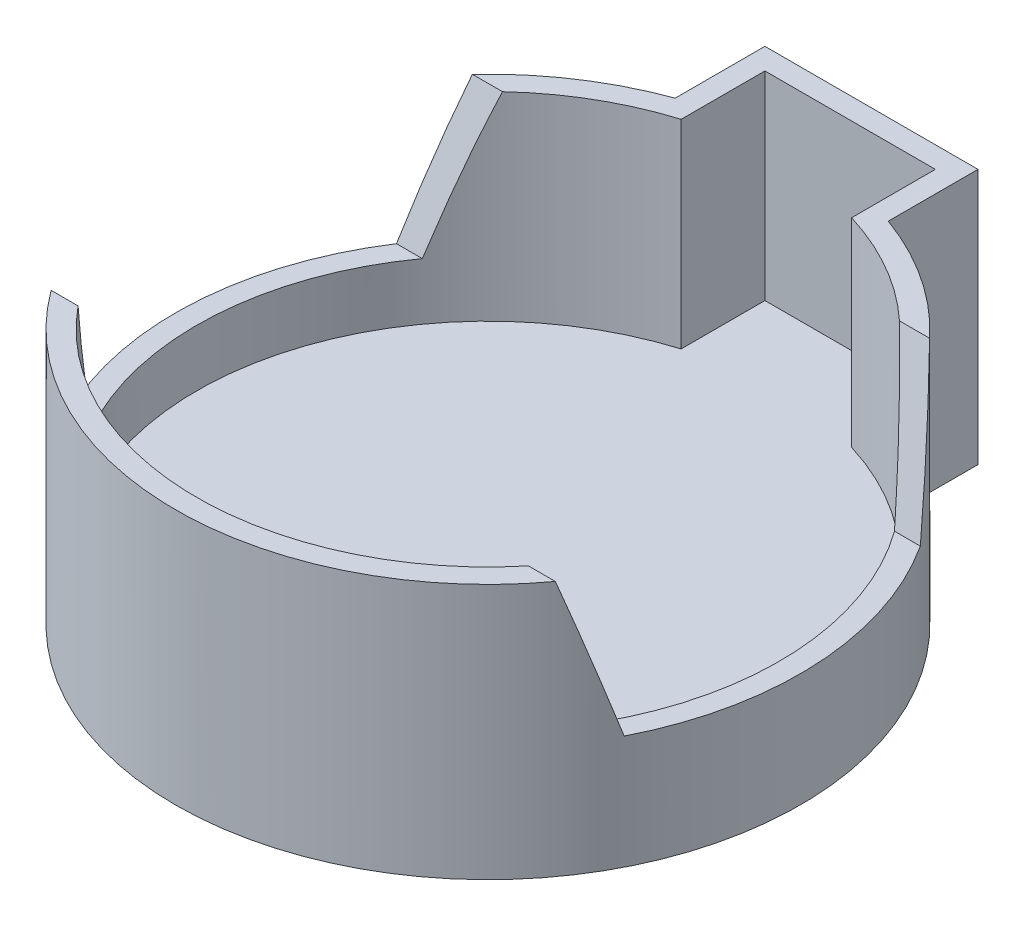
ISO-10303-21;
HEADER;
FILE_DESCRIPTION(('STEP AP214'),'2;1');
FILE_NAME('part.step','',(''),(''),'','','');
FILE_SCHEMA(('AUTOMOTIVE_DESIGN { 1 0 10303 214 1 1 1 1 }'));
ENDSEC;
DATA;
#1=APPLICATION_CONTEXT('core data for automotive mechanical design processes');
#2=APPLICATION_PROTOCOL_DEFINITION('international standard','automotive_design',2000,#1);
#3=PRODUCT_CONTEXT('',#1,'mechanical');
#4=PRODUCT('Part','Part','',(#3));
#5=PRODUCT_RELATED_PRODUCT_CATEGORY('part','',(#4));
#6=PRODUCT_DEFINITION_FORMATION('','',#4);
#7=PRODUCT_DEFINITION_CONTEXT('part definition',#1,'design');
#8=PRODUCT_DEFINITION('design','',#6,#7);
#9=PRODUCT_DEFINITION_SHAPE('','',#8);
#10=(LENGTH_UNIT() NAMED_UNIT(*) SI_UNIT(.MILLI.,.METRE.));
#11=(NAMED_UNIT(*) PLANE_ANGLE_UNIT() SI_UNIT($,.RADIAN.));
#12=(NAMED_UNIT(*) SI_UNIT($,.STERADIAN.) SOLID_ANGLE_UNIT());
#13=UNCERTAINTY_MEASURE_WITH_UNIT(LENGTH_MEASURE(1.E-05),#10,'distance_accuracy_value','');
#14=(GEOMETRIC_REPRESENTATION_CONTEXT(3) GLOBAL_UNCERTAINTY_ASSIGNED_CONTEXT((#13)) GLOBAL_UNIT_ASSIGNED_CONTEXT((#10,
#11,#12)) REPRESENTATION_CONTEXT('',''));
#15=CARTESIAN_POINT('',(0.,0.,0.));
#16=DIRECTION('',(0.,0.,1.));
#17=DIRECTION('',(1.,0.,0.));
#18=AXIS2_PLACEMENT_3D('',#15,#16,#17);
#19=CARTESIAN_POINT('',(0.,9.,0.));
#20=DIRECTION('',(0.,-1.,0.));
#21=DIRECTION('',(0.,0.,-1.));
#22=AXIS2_PLACEMENT_3D('',#19,#20,#21);
#23=PLANE('',#22);
#24=CARTESIAN_POINT('',(0.,9.,0.));
#25=DIRECTION('',(0.,1.,0.));
#26=DIRECTION('',(0.,0.,-1.));
#27=AXIS2_PLACEMENT_3D('',#24,#25,#26);
#28=CIRCLE('',#27,11.);
#29=CARTESIAN_POINT('',(-3.75,9.,-10.3410589399732));
#30=VERTEX_POINT('',#29);
#31=CARTESIAN_POINT('',(-8.04673846971554,9.,-7.5));
#32=VERTEX_POINT('',#31);
#33=EDGE_CURVE('E219',#30,#32,#28,.T.);
#34=ORIENTED_EDGE('',*,*,#33,.T.);
#35=DIRECTION('',(1.,0.,0.));
#36=VECTOR('',#35,1.);
#37=CARTESIAN_POINT('',(-11.,9.,-7.5));
#38=LINE('',#37,#36);
#39=CARTESIAN_POINT('',(-6.98659430624106,9.,-7.5));
#40=VERTEX_POINT('',#39);
#41=EDGE_CURVE('E173',#32,#40,#38,.T.);
#42=ORIENTED_EDGE('',*,*,#41,.T.);
#43=CARTESIAN_POINT('',(0.,9.,0.));
#44=DIRECTION('',(0.,-1.,0.));
#45=DIRECTION('',(0.,0.,-1.));
#46=AXIS2_PLACEMENT_3D('',#43,#44,#45);
#47=CIRCLE('',#46,10.25);
#48=CARTESIAN_POINT('',(-3.,9.,-9.80114789195633));
#49=VERTEX_POINT('',#48);
#50=EDGE_CURVE('E209',#49,#40,#47,.F.);
#51=ORIENTED_EDGE('',*,*,#50,.F.);
#52=DIRECTION('',(0.,0.,1.));
#53=VECTOR('',#52,1.);
#54=CARTESIAN_POINT('',(-3.,9.,0.));
#55=LINE('',#54,#53);
#56=CARTESIAN_POINT('',(-3.,9.,-12.75));
#57=VERTEX_POINT('',#56);
#58=EDGE_CURVE('E198',#57,#49,#55,.T.);
#59=ORIENTED_EDGE('',*,*,#58,.F.);
#60=DIRECTION('',(-1.,0.,0.));
#61=VECTOR('',#60,1.);
#62=CARTESIAN_POINT('',(0.,9.,-12.75));
#63=LINE('',#62,#61);
#64=CARTESIAN_POINT('',(3.,9.,-12.75));
#65=VERTEX_POINT('',#64);
#66=EDGE_CURVE('E215',#65,#57,#63,.T.);
#67=ORIENTED_EDGE('',*,*,#66,.F.);
#68=DIRECTION('',(0.,0.,-1.));
#69=VECTOR('',#68,1.);
#70=CARTESIAN_POINT('',(3.00000000000001,9.,0.));
#71=LINE('',#70,#69);
#72=CARTESIAN_POINT('',(3.,9.,-9.80114789195633));
#73=VERTEX_POINT('',#72);
#74=EDGE_CURVE('E212',#73,#65,#71,.T.);
#75=ORIENTED_EDGE('',*,*,#74,.F.);
#76=CARTESIAN_POINT('',(6.98659430624106,9.,-7.5));
#77=VERTEX_POINT('',#76);
#78=EDGE_CURVE('E208',#77,#73,#47,.F.);
#79=ORIENTED_EDGE('',*,*,#78,.F.);
#80=CARTESIAN_POINT('',(8.04673846971554,9.,-7.5));
#81=VERTEX_POINT('',#80);
#82=EDGE_CURVE('E176',#77,#81,#38,.T.);
#83=ORIENTED_EDGE('',*,*,#82,.T.);
#84=CARTESIAN_POINT('',(3.75,9.,-10.3410589399732));
#85=VERTEX_POINT('',#84);
#86=EDGE_CURVE('E223',#81,#85,#28,.T.);
#87=ORIENTED_EDGE('',*,*,#86,.T.);
#88=DIRECTION('',(0.,0.,-1.));
#89=VECTOR('',#88,1.);
#90=CARTESIAN_POINT('',(3.75,9.,-10.3410589399732));
#91=LINE('',#90,#89);
#92=CARTESIAN_POINT('',(3.75,9.,-13.5));
#93=VERTEX_POINT('',#92);
#94=EDGE_CURVE('E222',#85,#93,#91,.T.);
#95=ORIENTED_EDGE('',*,*,#94,.T.);
#96=DIRECTION('',(-1.,0.,0.));
#97=VECTOR('',#96,1.);
#98=CARTESIAN_POINT('',(-3.75,9.,-13.5));
#99=LINE('',#98,#97);
#100=CARTESIAN_POINT('',(-3.75,9.,-13.5));
#101=VERTEX_POINT('',#100);
#102=EDGE_CURVE('E225',#93,#101,#99,.T.);
#103=ORIENTED_EDGE('',*,*,#102,.T.);
#104=DIRECTION('',(0.,0.,1.));
#105=VECTOR('',#104,1.);
#106=CARTESIAN_POINT('',(-3.75,9.,-10.3410589399732));
#107=LINE('',#106,#105);
#108=EDGE_CURVE('E227',#101,#30,#107,.T.);
#109=ORIENTED_EDGE('',*,*,#108,.T.);
#110=EDGE_LOOP('',(#34,#42,#51,#59,#67,#75,#79,#83,#87,#95,#103,#109));
#111=FACE_BOUND('',#110,.T.);
#112=ADVANCED_FACE('F35',(#111),#23,.F.);
#113=CARTESIAN_POINT('',(-8.87411967464942,9.,6.5));
#114=VERTEX_POINT('',#113);
#115=CARTESIAN_POINT('',(8.87411967464942,9.,6.5));
#116=VERTEX_POINT('',#115);
#117=EDGE_CURVE('E172',#114,#116,#28,.T.);
#118=ORIENTED_EDGE('',*,*,#117,.T.);
#119=DIRECTION('',(1.,0.,0.));
#120=VECTOR('',#119,1.);
#121=CARTESIAN_POINT('',(-11.,9.,6.5));
#122=LINE('',#121,#120);
#123=CARTESIAN_POINT('',(7.92543374207367,9.,6.5));
#124=VERTEX_POINT('',#123);
#125=EDGE_CURVE('E179',#124,#116,#122,.T.);
#126=ORIENTED_EDGE('',*,*,#125,.F.);
#127=CARTESIAN_POINT('',(-7.92543374207368,9.,6.5));
#128=VERTEX_POINT('',#127);
#129=EDGE_CURVE('E213',#128,#124,#47,.F.);
#130=ORIENTED_EDGE('',*,*,#129,.F.);
#131=EDGE_CURVE('E59',#114,#128,#122,.T.);
#132=ORIENTED_EDGE('',*,*,#131,.F.);
#133=EDGE_LOOP('',(#118,#126,#130,#132));
#134=FACE_BOUND('',#133,.T.);
#135=ADVANCED_FACE('F261',(#134),#23,.F.);
#136=CARTESIAN_POINT('',(0.,9.,0.));
#137=DIRECTION('',(0.,-1.,0.));
#138=DIRECTION('',(0.,0.,-1.));
#139=AXIS2_PLACEMENT_3D('',#136,#137,#138);
#140=CYLINDRICAL_SURFACE('',#139,11.);
#141=ORIENTED_EDGE('',*,*,#86,.F.);
#142=CARTESIAN_POINT('',(0.,-16.,0.));
#143=DIRECTION('',(0.,-0.287347885566346,-0.957826285221151));
#144=DIRECTION('',(0.,-0.957826285221151,0.287347885566346));
#145=AXIS2_PLACEMENT_3D('',#142,#143,#144);
#146=ELLIPSE('',#145,38.2811238660053,11.);
#147=CARTESIAN_POINT('',(9.21954445729289,4.,-6.));
#148=VERTEX_POINT('',#147);
#149=EDGE_CURVE('E181',#81,#148,#146,.T.);
#150=ORIENTED_EDGE('',*,*,#149,.T.);
#151=CARTESIAN_POINT('',(0.,4.,0.));
#152=DIRECTION('',(0.,-1.,0.));
#153=DIRECTION('',(0.,0.,-1.));
#154=AXIS2_PLACEMENT_3D('',#151,#152,#153);
#155=CIRCLE('',#154,11.);
#156=CARTESIAN_POINT('',(9.79795897113271,4.,5.));
#157=VERTEX_POINT('',#156);
#158=EDGE_CURVE('E160',#148,#157,#155,.T.);
#159=ORIENTED_EDGE('',*,*,#158,.T.);
#160=CARTESIAN_POINT('',(0.,-12.6666666666667,0.));
#161=DIRECTION('',(0.,-0.287347885566346,0.957826285221151));
#162=DIRECTION('',(0.,-0.957826285221151,-0.287347885566346));
#163=AXIS2_PLACEMENT_3D('',#160,#161,#162);
#164=ELLIPSE('',#163,38.2811238660053,11.);
#165=EDGE_CURVE('E161',#157,#116,#164,.T.);
#166=ORIENTED_EDGE('',*,*,#165,.T.);
#167=ORIENTED_EDGE('',*,*,#117,.F.);
#168=CARTESIAN_POINT('',(-9.79795897113271,4.,5.));
#169=VERTEX_POINT('',#168);
#170=EDGE_CURVE('E164',#114,#169,#164,.T.);
#171=ORIENTED_EDGE('',*,*,#170,.T.);
#172=CARTESIAN_POINT('',(-9.21954445729289,4.,-6.));
#173=VERTEX_POINT('',#172);
#174=EDGE_CURVE('E149',#169,#173,#155,.T.);
#175=ORIENTED_EDGE('',*,*,#174,.T.);
#176=EDGE_CURVE('E184',#173,#32,#146,.T.);
#177=ORIENTED_EDGE('',*,*,#176,.T.);
#178=ORIENTED_EDGE('',*,*,#33,.F.);
#179=DIRECTION('',(0.,-1.,0.));
#180=VECTOR('',#179,1.);
#181=CARTESIAN_POINT('',(-3.75,9.,-10.3410589399732));
#182=LINE('',#181,#180);
#183=CARTESIAN_POINT('',(-3.75,0.,-10.3410589399732));
#184=VERTEX_POINT('',#183);
#185=EDGE_CURVE('E229',#30,#184,#182,.T.);
#186=ORIENTED_EDGE('',*,*,#185,.T.);
#187=CARTESIAN_POINT('',(0.,0.,0.));
#188=DIRECTION('',(0.,1.,0.));
#189=DIRECTION('',(0.,0.,-1.));
#190=AXIS2_PLACEMENT_3D('',#187,#188,#189);
#191=CIRCLE('',#190,11.);
#192=CARTESIAN_POINT('',(3.75,0.,-10.3410589399732));
#193=VERTEX_POINT('',#192);
#194=EDGE_CURVE('E192',#184,#193,#191,.T.);
#195=ORIENTED_EDGE('',*,*,#194,.T.);
#196=DIRECTION('',(0.,-1.,0.));
#197=VECTOR('',#196,1.);
#198=CARTESIAN_POINT('',(3.75,9.,-10.3410589399732));
#199=LINE('',#198,#197);
#200=EDGE_CURVE('E246',#85,#193,#199,.T.);
#201=ORIENTED_EDGE('',*,*,#200,.F.);
#202=EDGE_LOOP('',(#141,#150,#159,#166,#167,#171,#175,#177,#178,#186,#195,#201));
#203=FACE_BOUND('',#202,.T.);
#204=ADVANCED_FACE('F37',(#203),#140,.T.);
#205=CARTESIAN_POINT('',(3.75,9.,-10.3410589399732));
#206=DIRECTION('',(-1.,0.,0.));
#207=DIRECTION('',(0.,0.,1.));
#208=AXIS2_PLACEMENT_3D('',#205,#206,#207);
#209=PLANE('',#208);
#210=DIRECTION('',(0.,0.,-1.));
#211=VECTOR('',#210,1.);
#212=CARTESIAN_POINT('',(3.75,0.,-10.3410589399732));
#213=LINE('',#212,#211);
#214=CARTESIAN_POINT('',(3.75,0.,-13.5));
#215=VERTEX_POINT('',#214);
#216=EDGE_CURVE('E232',#193,#215,#213,.T.);
#217=ORIENTED_EDGE('',*,*,#216,.T.);
#218=DIRECTION('',(0.,-1.,0.));
#219=VECTOR('',#218,1.);
#220=CARTESIAN_POINT('',(3.75,9.,-13.5));
#221=LINE('',#220,#219);
#222=EDGE_CURVE('E243',#93,#215,#221,.T.);
#223=ORIENTED_EDGE('',*,*,#222,.F.);
#224=ORIENTED_EDGE('',*,*,#94,.F.);
#225=ORIENTED_EDGE('',*,*,#200,.T.);
#226=EDGE_LOOP('',(#217,#223,#224,#225));
#227=FACE_BOUND('',#226,.T.);
#228=ADVANCED_FACE('F300',(#227),#209,.F.);
#229=CARTESIAN_POINT('',(-3.75,9.,-13.5));
#230=DIRECTION('',(0.,0.,1.));
#231=DIRECTION('',(1.,0.,0.));
#232=AXIS2_PLACEMENT_3D('',#229,#230,#231);
#233=PLANE('',#232);
#234=DIRECTION('',(-1.,0.,0.));
#235=VECTOR('',#234,1.);
#236=CARTESIAN_POINT('',(-3.75,0.,-13.5));
#237=LINE('',#236,#235);
#238=CARTESIAN_POINT('',(-3.75,0.,-13.5));
#239=VERTEX_POINT('',#238);
#240=EDGE_CURVE('E234',#215,#239,#237,.T.);
#241=ORIENTED_EDGE('',*,*,#240,.T.);
#242=DIRECTION('',(0.,-1.,0.));
#243=VECTOR('',#242,1.);
#244=CARTESIAN_POINT('',(-3.75,9.,-13.5));
#245=LINE('',#244,#243);
#246=EDGE_CURVE('E240',#101,#239,#245,.T.);
#247=ORIENTED_EDGE('',*,*,#246,.F.);
#248=ORIENTED_EDGE('',*,*,#102,.F.);
#249=ORIENTED_EDGE('',*,*,#222,.T.);
#250=EDGE_LOOP('',(#241,#247,#248,#249));
#251=FACE_BOUND('',#250,.T.);
#252=ADVANCED_FACE('F326',(#251),#233,.F.);
#253=CARTESIAN_POINT('',(-3.75,9.,-10.3410589399732));
#254=DIRECTION('',(1.,0.,0.));
#255=DIRECTION('',(0.,0.,-1.));
#256=AXIS2_PLACEMENT_3D('',#253,#254,#255);
#257=PLANE('',#256);
#258=DIRECTION('',(0.,0.,1.));
#259=VECTOR('',#258,1.);
#260=CARTESIAN_POINT('',(-3.75,0.,-10.3410589399732));
#261=LINE('',#260,#259);
#262=EDGE_CURVE('E236',#239,#184,#261,.T.);
#263=ORIENTED_EDGE('',*,*,#262,.T.);
#264=ORIENTED_EDGE('',*,*,#185,.F.);
#265=ORIENTED_EDGE('',*,*,#108,.F.);
#266=ORIENTED_EDGE('',*,*,#246,.T.);
#267=EDGE_LOOP('',(#263,#264,#265,#266));
#268=FACE_BOUND('',#267,.T.);
#269=ADVANCED_FACE('F323',(#268),#257,.F.);
#270=CARTESIAN_POINT('',(0.,0.,0.));
#271=DIRECTION('',(0.,-1.,0.));
#272=DIRECTION('',(0.,0.,-1.));
#273=AXIS2_PLACEMENT_3D('',#270,#271,#272);
#274=PLANE('',#273);
#275=ORIENTED_EDGE('',*,*,#194,.F.);
#276=ORIENTED_EDGE('',*,*,#262,.F.);
#277=ORIENTED_EDGE('',*,*,#240,.F.);
#278=ORIENTED_EDGE('',*,*,#216,.F.);
#279=EDGE_LOOP('',(#275,#276,#277,#278));
#280=FACE_BOUND('',#279,.T.);
#281=ADVANCED_FACE('F295',(#280),#274,.T.);
#282=CARTESIAN_POINT('',(0.,9.,0.));
#283=DIRECTION('',(0.,-1.,0.));
#284=DIRECTION('',(0.,0.,-1.));
#285=AXIS2_PLACEMENT_3D('',#282,#283,#284);
#286=CYLINDRICAL_SURFACE('',#285,10.25);
#287=CARTESIAN_POINT('',(0.,-16.,0.));
#288=DIRECTION('',(0.,-0.287347885566346,-0.957826285221151));
#289=DIRECTION('',(0.,-0.957826285221151,0.287347885566346));
#290=AXIS2_PLACEMENT_3D('',#287,#288,#289);
#291=ELLIPSE('',#290,35.6710472387777,10.25);
#292=CARTESIAN_POINT('',(8.31038506929733,4.,-6.));
#293=VERTEX_POINT('',#292);
#294=EDGE_CURVE('E11',#77,#293,#291,.T.);
#295=ORIENTED_EDGE('',*,*,#294,.F.);
#296=ORIENTED_EDGE('',*,*,#78,.T.);
#297=DIRECTION('',(0.,-1.,0.));
#298=VECTOR('',#297,1.);
#299=CARTESIAN_POINT('',(3.,9.,-9.80114789195633));
#300=LINE('',#299,#298);
#301=CARTESIAN_POINT('',(3.,2.,-9.80114789195633));
#302=VERTEX_POINT('',#301);
#303=EDGE_CURVE('E189',#73,#302,#300,.T.);
#304=ORIENTED_EDGE('',*,*,#303,.T.);
#305=CARTESIAN_POINT('',(0.,2.,0.));
#306=DIRECTION('',(0.,-1.,0.));
#307=DIRECTION('',(0.,0.,-1.));
#308=AXIS2_PLACEMENT_3D('',#305,#306,#307);
#309=CIRCLE('',#308,10.25);
#310=CARTESIAN_POINT('',(-3.,2.,-9.80114789195633));
#311=VERTEX_POINT('',#310);
#312=EDGE_CURVE('E185',#311,#302,#309,.F.);
#313=ORIENTED_EDGE('',*,*,#312,.F.);
#314=DIRECTION('',(0.,-1.,0.));
#315=VECTOR('',#314,1.);
#316=CARTESIAN_POINT('',(-3.,9.,-9.80114789195633));
#317=LINE('',#316,#315);
#318=EDGE_CURVE('E194',#49,#311,#317,.T.);
#319=ORIENTED_EDGE('',*,*,#318,.F.);
#320=ORIENTED_EDGE('',*,*,#50,.T.);
#321=CARTESIAN_POINT('',(-8.31038506929733,4.,-6.));
#322=VERTEX_POINT('',#321);
#323=EDGE_CURVE('E39',#322,#40,#291,.T.);
#324=ORIENTED_EDGE('',*,*,#323,.F.);
#325=CARTESIAN_POINT('',(0.,4.,0.));
#326=DIRECTION('',(0.,-1.,0.));
#327=DIRECTION('',(0.,0.,-1.));
#328=AXIS2_PLACEMENT_3D('',#325,#326,#327);
#329=CIRCLE('',#328,10.25);
#330=CARTESIAN_POINT('',(-8.94776508408664,4.,5.));
#331=VERTEX_POINT('',#330);
#332=EDGE_CURVE('E249',#331,#322,#329,.T.);
#333=ORIENTED_EDGE('',*,*,#332,.F.);
#334=CARTESIAN_POINT('',(0.,-12.6666666666667,0.));
#335=DIRECTION('',(0.,-0.287347885566346,0.957826285221151));
#336=DIRECTION('',(0.,-0.957826285221151,-0.287347885566346));
#337=AXIS2_PLACEMENT_3D('',#334,#335,#336);
#338=ELLIPSE('',#337,35.6710472387777,10.25);
#339=EDGE_CURVE('E165',#128,#331,#338,.T.);
#340=ORIENTED_EDGE('',*,*,#339,.F.);
#341=ORIENTED_EDGE('',*,*,#129,.T.);
#342=CARTESIAN_POINT('',(8.94776508408663,4.,5.));
#343=VERTEX_POINT('',#342);
#344=EDGE_CURVE('E250',#343,#124,#338,.T.);
#345=ORIENTED_EDGE('',*,*,#344,.F.);
#346=EDGE_CURVE('E44',#293,#343,#329,.T.);
#347=ORIENTED_EDGE('',*,*,#346,.F.);
#348=EDGE_LOOP('',(#295,#296,#304,#313,#319,#320,#324,#333,#340,#341,#345,#347));
#349=FACE_BOUND('',#348,.T.);
#350=ADVANCED_FACE('F263',(#349),#286,.F.);
#351=CARTESIAN_POINT('',(3.,9.,-10.3410589399732));
#352=DIRECTION('',(-1.,0.,0.));
#353=DIRECTION('',(0.,0.,1.));
#354=AXIS2_PLACEMENT_3D('',#351,#352,#353);
#355=PLANE('',#354);
#356=DIRECTION('',(0.,0.,-1.));
#357=VECTOR('',#356,1.);
#358=CARTESIAN_POINT('',(3.00000000000001,2.,0.));
#359=LINE('',#358,#357);
#360=CARTESIAN_POINT('',(3.,2.,-12.75));
#361=VERTEX_POINT('',#360);
#362=EDGE_CURVE('E188',#302,#361,#359,.T.);
#363=ORIENTED_EDGE('',*,*,#362,.F.);
#364=ORIENTED_EDGE('',*,*,#303,.F.);
#365=ORIENTED_EDGE('',*,*,#74,.T.);
#366=DIRECTION('',(0.,-1.,0.));
#367=VECTOR('',#366,1.);
#368=CARTESIAN_POINT('',(3.,9.,-12.75));
#369=LINE('',#368,#367);
#370=EDGE_CURVE('E193',#65,#361,#369,.T.);
#371=ORIENTED_EDGE('',*,*,#370,.T.);
#372=EDGE_LOOP('',(#363,#364,#365,#371));
#373=FACE_BOUND('',#372,.T.);
#374=ADVANCED_FACE('F271',(#373),#355,.T.);
#375=CARTESIAN_POINT('',(-3.75,9.,-12.75));
#376=DIRECTION('',(0.,0.,1.));
#377=DIRECTION('',(1.,0.,0.));
#378=AXIS2_PLACEMENT_3D('',#375,#376,#377);
#379=PLANE('',#378);
#380=DIRECTION('',(-1.,0.,0.));
#381=VECTOR('',#380,1.);
#382=CARTESIAN_POINT('',(0.,2.,-12.75));
#383=LINE('',#382,#381);
#384=CARTESIAN_POINT('',(-3.,2.,-12.75));
#385=VERTEX_POINT('',#384);
#386=EDGE_CURVE('E200',#361,#385,#383,.T.);
#387=ORIENTED_EDGE('',*,*,#386,.F.);
#388=ORIENTED_EDGE('',*,*,#370,.F.);
#389=ORIENTED_EDGE('',*,*,#66,.T.);
#390=DIRECTION('',(0.,-1.,0.));
#391=VECTOR('',#390,1.);
#392=CARTESIAN_POINT('',(-3.,9.,-12.75));
#393=LINE('',#392,#391);
#394=EDGE_CURVE('E197',#57,#385,#393,.T.);
#395=ORIENTED_EDGE('',*,*,#394,.T.);
#396=EDGE_LOOP('',(#387,#388,#389,#395));
#397=FACE_BOUND('',#396,.T.);
#398=ADVANCED_FACE('F278',(#397),#379,.T.);
#399=CARTESIAN_POINT('',(-3.,9.,-10.3410589399732));
#400=DIRECTION('',(1.,0.,0.));
#401=DIRECTION('',(0.,0.,-1.));
#402=AXIS2_PLACEMENT_3D('',#399,#400,#401);
#403=PLANE('',#402);
#404=DIRECTION('',(0.,0.,1.));
#405=VECTOR('',#404,1.);
#406=CARTESIAN_POINT('',(-3.,2.,0.));
#407=LINE('',#406,#405);
#408=EDGE_CURVE('E204',#385,#311,#407,.T.);
#409=ORIENTED_EDGE('',*,*,#408,.F.);
#410=ORIENTED_EDGE('',*,*,#394,.F.);
#411=ORIENTED_EDGE('',*,*,#58,.T.);
#412=ORIENTED_EDGE('',*,*,#318,.T.);
#413=EDGE_LOOP('',(#409,#410,#411,#412));
#414=FACE_BOUND('',#413,.T.);
#415=ADVANCED_FACE('F356',(#414),#403,.T.);
#416=CARTESIAN_POINT('',(0.,2.,0.));
#417=DIRECTION('',(0.,-1.,0.));
#418=DIRECTION('',(0.,0.,-1.));
#419=AXIS2_PLACEMENT_3D('',#416,#417,#418);
#420=PLANE('',#419);
#421=ORIENTED_EDGE('',*,*,#312,.T.);
#422=ORIENTED_EDGE('',*,*,#362,.T.);
#423=ORIENTED_EDGE('',*,*,#386,.T.);
#424=ORIENTED_EDGE('',*,*,#408,.T.);
#425=EDGE_LOOP('',(#421,#422,#423,#424));
#426=FACE_BOUND('',#425,.T.);
#427=ADVANCED_FACE('F281',(#426),#420,.F.);
#428=CARTESIAN_POINT('',(-11.,9.,6.5));
#429=DIRECTION('',(0.,-0.287347885566346,0.957826285221151));
#430=DIRECTION('',(0.,-0.957826285221151,-0.287347885566346));
#431=AXIS2_PLACEMENT_3D('',#428,#429,#430);
#432=PLANE('',#431);
#433=ORIENTED_EDGE('',*,*,#131,.T.);
#434=ORIENTED_EDGE('',*,*,#339,.T.);
#435=DIRECTION('',(1.,0.,0.));
#436=VECTOR('',#435,1.);
#437=CARTESIAN_POINT('',(-11.,4.,5.));
#438=LINE('',#437,#436);
#439=EDGE_CURVE('E152',#169,#331,#438,.T.);
#440=ORIENTED_EDGE('',*,*,#439,.F.);
#441=ORIENTED_EDGE('',*,*,#170,.F.);
#442=EDGE_LOOP('',(#433,#434,#440,#441));
#443=FACE_BOUND('',#442,.T.);
#444=ADVANCED_FACE('F163',(#443),#432,.F.);
#445=CARTESIAN_POINT('',(-11.,4.,5.));
#446=DIRECTION('',(0.,-1.,0.));
#447=DIRECTION('',(0.,0.,-1.));
#448=AXIS2_PLACEMENT_3D('',#445,#446,#447);
#449=PLANE('',#448);
#450=ORIENTED_EDGE('',*,*,#439,.T.);
#451=ORIENTED_EDGE('',*,*,#332,.T.);
#452=DIRECTION('',(1.,0.,0.));
#453=VECTOR('',#452,1.);
#454=CARTESIAN_POINT('',(-11.,4.,-6.));
#455=LINE('',#454,#453);
#456=EDGE_CURVE('E155',#173,#322,#455,.T.);
#457=ORIENTED_EDGE('',*,*,#456,.F.);
#458=ORIENTED_EDGE('',*,*,#174,.F.);
#459=EDGE_LOOP('',(#450,#451,#457,#458));
#460=FACE_BOUND('',#459,.T.);
#461=ADVANCED_FACE('F151',(#460),#449,.F.);
#462=CARTESIAN_POINT('',(-11.,4.,-6.));
#463=DIRECTION('',(0.,-0.287347885566346,-0.957826285221151));
#464=DIRECTION('',(0.,0.957826285221151,-0.287347885566346));
#465=AXIS2_PLACEMENT_3D('',#462,#463,#464);
#466=PLANE('',#465);
#467=ORIENTED_EDGE('',*,*,#456,.T.);
#468=ORIENTED_EDGE('',*,*,#323,.T.);
#469=ORIENTED_EDGE('',*,*,#41,.F.);
#470=ORIENTED_EDGE('',*,*,#176,.F.);
#471=EDGE_LOOP('',(#467,#468,#469,#470));
#472=FACE_BOUND('',#471,.T.);
#473=ADVANCED_FACE('F287',(#472),#466,.F.);
#474=ORIENTED_EDGE('',*,*,#82,.F.);
#475=ORIENTED_EDGE('',*,*,#294,.T.);
#476=EDGE_CURVE('E166',#293,#148,#455,.T.);
#477=ORIENTED_EDGE('',*,*,#476,.T.);
#478=ORIENTED_EDGE('',*,*,#149,.F.);
#479=EDGE_LOOP('',(#474,#475,#477,#478));
#480=FACE_BOUND('',#479,.T.);
#481=ADVANCED_FACE('F305',(#480),#466,.F.);
#482=ORIENTED_EDGE('',*,*,#476,.F.);
#483=ORIENTED_EDGE('',*,*,#346,.T.);
#484=EDGE_CURVE('E51',#343,#157,#438,.T.);
#485=ORIENTED_EDGE('',*,*,#484,.T.);
#486=ORIENTED_EDGE('',*,*,#158,.F.);
#487=EDGE_LOOP('',(#482,#483,#485,#486));
#488=FACE_BOUND('',#487,.T.);
#489=ADVANCED_FACE('F304',(#488),#449,.F.);
#490=ORIENTED_EDGE('',*,*,#484,.F.);
#491=ORIENTED_EDGE('',*,*,#344,.T.);
#492=ORIENTED_EDGE('',*,*,#125,.T.);
#493=ORIENTED_EDGE('',*,*,#165,.F.);
#494=EDGE_LOOP('',(#490,#491,#492,#493));
#495=FACE_BOUND('',#494,.T.);
#496=ADVANCED_FACE('F256',(#495),#432,.F.);
#497=CLOSED_SHELL('',(#112,#135,#204,#228,#252,#269,#281,#350,#374,#398,#415,#427,#444,#461,
#473,#481,#489,#496));
#498=MANIFOLD_SOLID_BREP('B2',#497);
#499=ADVANCED_BREP_SHAPE_REPRESENTATION('',(#18,#498),#14);
#500=SHAPE_DEFINITION_REPRESENTATION(#9,#499);
ENDSEC;
END-ISO-10303-21;
